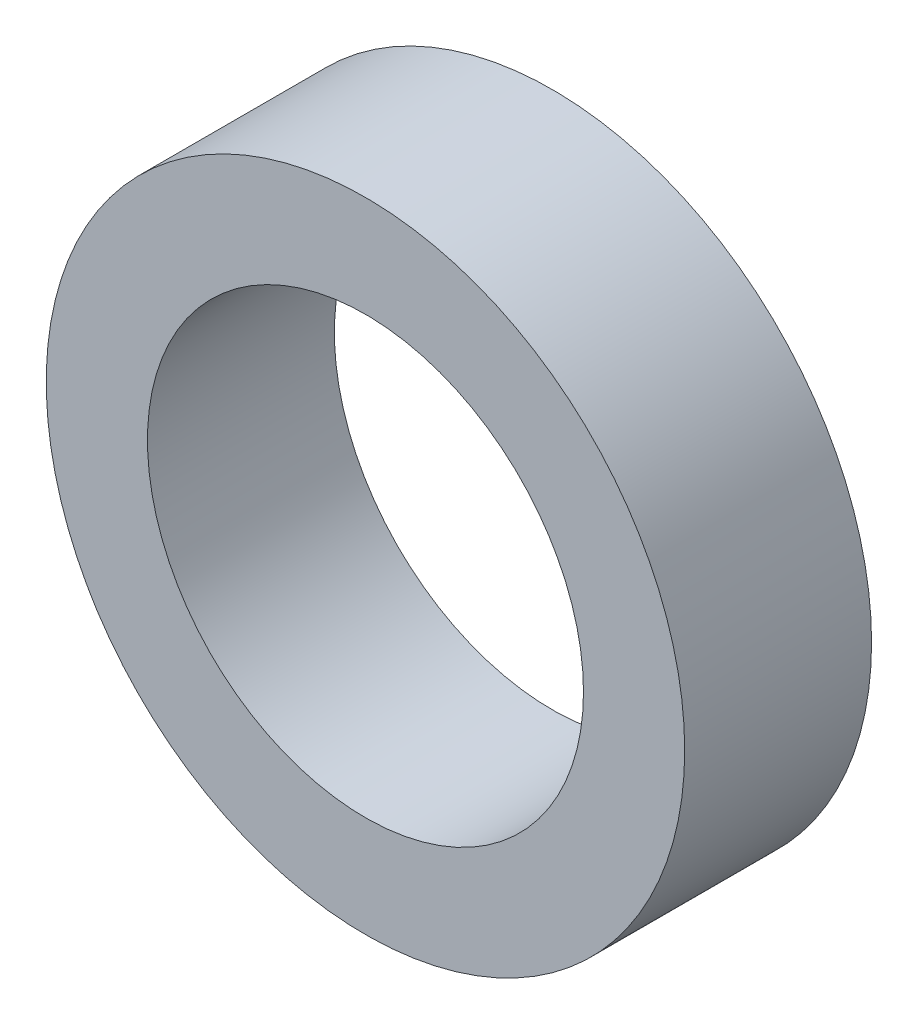
ISO-10303-21;
HEADER;
FILE_DESCRIPTION(('STEP AP214'),'2;1');
FILE_NAME('part.step','',(''),(''),'','','');
FILE_SCHEMA(('AUTOMOTIVE_DESIGN { 1 0 10303 214 1 1 1 1 }'));
ENDSEC;
DATA;
#1=APPLICATION_CONTEXT('core data for automotive mechanical design processes');
#2=APPLICATION_PROTOCOL_DEFINITION('international standard','automotive_design',2000,#1);
#3=PRODUCT_CONTEXT('',#1,'mechanical');
#4=PRODUCT('Part','Part','',(#3));
#5=PRODUCT_RELATED_PRODUCT_CATEGORY('part','',(#4));
#6=PRODUCT_DEFINITION_FORMATION('','',#4);
#7=PRODUCT_DEFINITION_CONTEXT('part definition',#1,'design');
#8=PRODUCT_DEFINITION('design','',#6,#7);
#9=PRODUCT_DEFINITION_SHAPE('','',#8);
#10=(LENGTH_UNIT() NAMED_UNIT(*) SI_UNIT(.MILLI.,.METRE.));
#11=(NAMED_UNIT(*) PLANE_ANGLE_UNIT() SI_UNIT($,.RADIAN.));
#12=(NAMED_UNIT(*) SI_UNIT($,.STERADIAN.) SOLID_ANGLE_UNIT());
#13=UNCERTAINTY_MEASURE_WITH_UNIT(LENGTH_MEASURE(1.E-05),#10,'distance_accuracy_value','');
#14=(GEOMETRIC_REPRESENTATION_CONTEXT(3) GLOBAL_UNCERTAINTY_ASSIGNED_CONTEXT((#13)) GLOBAL_UNIT_ASSIGNED_CONTEXT((#10,
#11,#12)) REPRESENTATION_CONTEXT('',''));
#15=CARTESIAN_POINT('',(0.,0.,0.));
#16=DIRECTION('',(0.,0.,1.));
#17=DIRECTION('',(1.,0.,0.));
#18=AXIS2_PLACEMENT_3D('',#15,#16,#17);
#19=CARTESIAN_POINT('',(0.,0.,-12.));
#20=DIRECTION('',(0.,0.,1.));
#21=DIRECTION('',(1.,0.,0.));
#22=AXIS2_PLACEMENT_3D('',#19,#20,#21);
#23=CYLINDRICAL_SURFACE('',#22,20.5);
#24=CARTESIAN_POINT('',(0.,0.,-12.));
#25=DIRECTION('',(0.,0.,1.));
#26=DIRECTION('',(1.,0.,0.));
#27=AXIS2_PLACEMENT_3D('',#24,#25,#26);
#28=CIRCLE('',#27,20.5);
#29=CARTESIAN_POINT('',(20.5,0.,-12.));
#30=VERTEX_POINT('',#29);
#31=EDGE_CURVE('E10',#30,#30,#28,.T.);
#32=ORIENTED_EDGE('',*,*,#31,.T.);
#33=EDGE_LOOP('',(#32));
#34=FACE_BOUND('',#33,.T.);
#35=CARTESIAN_POINT('',(0.,0.,0.));
#36=DIRECTION('',(0.,0.,1.));
#37=DIRECTION('',(1.,0.,0.));
#38=AXIS2_PLACEMENT_3D('',#35,#36,#37);
#39=CIRCLE('',#38,20.5);
#40=CARTESIAN_POINT('',(20.5,0.,0.));
#41=VERTEX_POINT('',#40);
#42=EDGE_CURVE('E44',#41,#41,#39,.T.);
#43=ORIENTED_EDGE('',*,*,#42,.F.);
#44=EDGE_LOOP('',(#43));
#45=FACE_BOUND('',#44,.T.);
#46=ADVANCED_FACE('F41',(#34,#45),#23,.T.);
#47=CARTESIAN_POINT('',(0.,0.,-12.));
#48=DIRECTION('',(0.,0.,1.));
#49=DIRECTION('',(1.,0.,0.));
#50=AXIS2_PLACEMENT_3D('',#47,#48,#49);
#51=PLANE('',#50);
#52=CARTESIAN_POINT('',(0.,0.,-12.));
#53=DIRECTION('',(0.,0.,1.));
#54=DIRECTION('',(1.,0.,0.));
#55=AXIS2_PLACEMENT_3D('',#52,#53,#54);
#56=CIRCLE('',#55,14.);
#57=CARTESIAN_POINT('',(14.,0.,-12.));
#58=VERTEX_POINT('',#57);
#59=EDGE_CURVE('E51',#58,#58,#56,.T.);
#60=ORIENTED_EDGE('',*,*,#59,.T.);
#61=EDGE_LOOP('',(#60));
#62=FACE_BOUND('',#61,.T.);
#63=ORIENTED_EDGE('',*,*,#31,.F.);
#64=EDGE_LOOP('',(#63));
#65=FACE_BOUND('',#64,.T.);
#66=ADVANCED_FACE('F59',(#62,#65),#51,.F.);
#67=CARTESIAN_POINT('',(0.,0.,0.));
#68=DIRECTION('',(0.,0.,1.));
#69=DIRECTION('',(1.,0.,0.));
#70=AXIS2_PLACEMENT_3D('',#67,#68,#69);
#71=PLANE('',#70);
#72=CARTESIAN_POINT('',(0.,0.,0.));
#73=DIRECTION('',(0.,0.,1.));
#74=DIRECTION('',(1.,0.,0.));
#75=AXIS2_PLACEMENT_3D('',#72,#73,#74);
#76=CIRCLE('',#75,14.);
#77=CARTESIAN_POINT('',(14.,0.,0.));
#78=VERTEX_POINT('',#77);
#79=EDGE_CURVE('E53',#78,#78,#76,.T.);
#80=ORIENTED_EDGE('',*,*,#79,.F.);
#81=EDGE_LOOP('',(#80));
#82=FACE_BOUND('',#81,.T.);
#83=ORIENTED_EDGE('',*,*,#42,.T.);
#84=EDGE_LOOP('',(#83));
#85=FACE_BOUND('',#84,.T.);
#86=ADVANCED_FACE('F65',(#82,#85),#71,.T.);
#87=CARTESIAN_POINT('',(0.,0.,-12.));
#88=DIRECTION('',(0.,0.,1.));
#89=DIRECTION('',(1.,0.,0.));
#90=AXIS2_PLACEMENT_3D('',#87,#88,#89);
#91=CYLINDRICAL_SURFACE('',#90,14.);
#92=ORIENTED_EDGE('',*,*,#59,.F.);
#93=EDGE_LOOP('',(#92));
#94=FACE_BOUND('',#93,.T.);
#95=ORIENTED_EDGE('',*,*,#79,.T.);
#96=EDGE_LOOP('',(#95));
#97=FACE_BOUND('',#96,.T.);
#98=ADVANCED_FACE('F62',(#94,#97),#91,.F.);
#99=CLOSED_SHELL('',(#46,#66,#86,#98));
#100=MANIFOLD_SOLID_BREP('B2',#99);
#101=ADVANCED_BREP_SHAPE_REPRESENTATION('',(#18,#100),#14);
#102=SHAPE_DEFINITION_REPRESENTATION(#9,#101);
ENDSEC;
END-ISO-10303-21;
